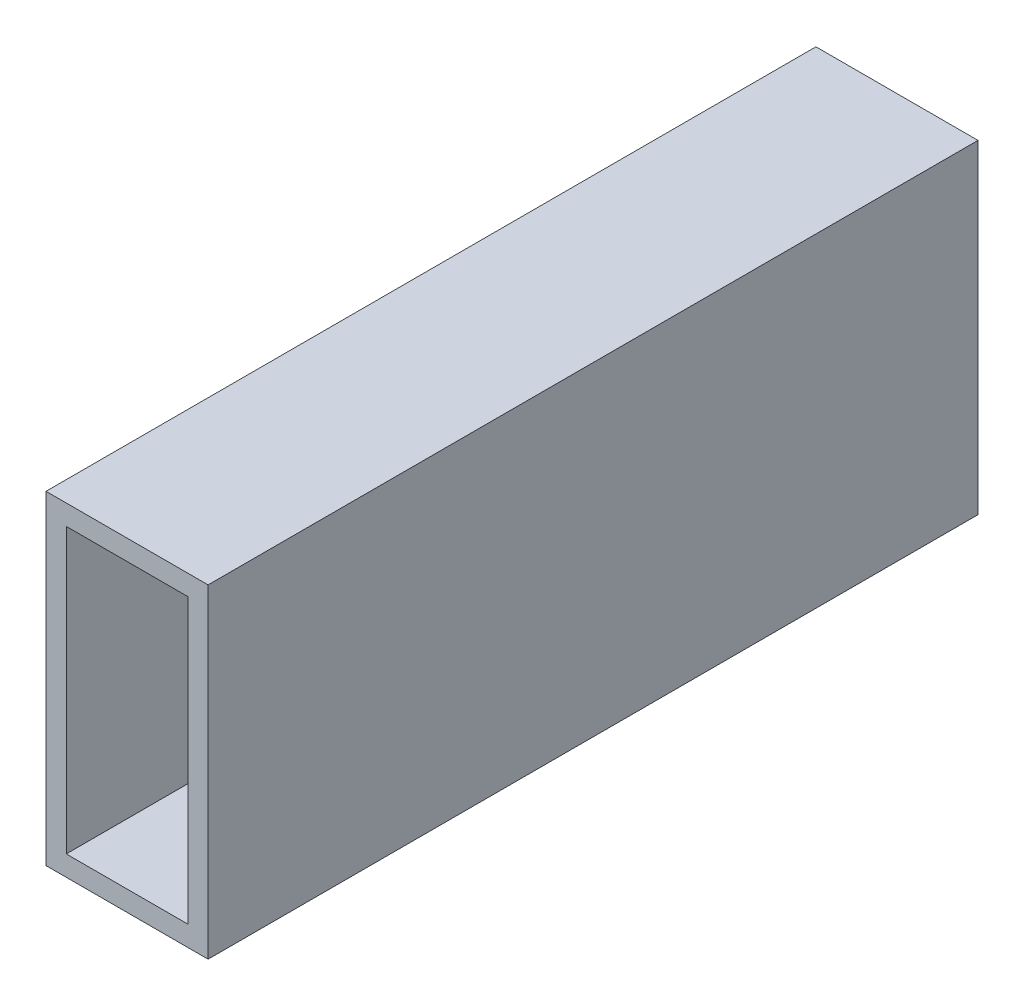
ISO-10303-21;
HEADER;
FILE_DESCRIPTION(('STEP AP214'),'2;1');
FILE_NAME('part.step','',(''),(''),'','','');
FILE_SCHEMA(('AUTOMOTIVE_DESIGN { 1 0 10303 214 1 1 1 1 }'));
ENDSEC;
DATA;
#1=APPLICATION_CONTEXT('core data for automotive mechanical design processes');
#2=APPLICATION_PROTOCOL_DEFINITION('international standard','automotive_design',2000,#1);
#3=PRODUCT_CONTEXT('',#1,'mechanical');
#4=PRODUCT('Part','Part','',(#3));
#5=PRODUCT_RELATED_PRODUCT_CATEGORY('part','',(#4));
#6=PRODUCT_DEFINITION_FORMATION('','',#4);
#7=PRODUCT_DEFINITION_CONTEXT('part definition',#1,'design');
#8=PRODUCT_DEFINITION('design','',#6,#7);
#9=PRODUCT_DEFINITION_SHAPE('','',#8);
#10=(LENGTH_UNIT() NAMED_UNIT(*) SI_UNIT(.MILLI.,.METRE.));
#11=(NAMED_UNIT(*) PLANE_ANGLE_UNIT() SI_UNIT($,.RADIAN.));
#12=(NAMED_UNIT(*) SI_UNIT($,.STERADIAN.) SOLID_ANGLE_UNIT());
#13=UNCERTAINTY_MEASURE_WITH_UNIT(LENGTH_MEASURE(1.E-05),#10,'distance_accuracy_value','');
#14=(GEOMETRIC_REPRESENTATION_CONTEXT(3) GLOBAL_UNCERTAINTY_ASSIGNED_CONTEXT((#13)) GLOBAL_UNIT_ASSIGNED_CONTEXT((#10,
#11,#12)) REPRESENTATION_CONTEXT('',''));
#15=CARTESIAN_POINT('',(0.,0.,0.));
#16=DIRECTION('',(0.,0.,1.));
#17=DIRECTION('',(1.,0.,0.));
#18=AXIS2_PLACEMENT_3D('',#15,#16,#17);
#19=CARTESIAN_POINT('',(0.,0.,120.65));
#20=DIRECTION('',(0.,0.,-1.));
#21=DIRECTION('',(-1.,0.,0.));
#22=AXIS2_PLACEMENT_3D('',#19,#20,#21);
#23=PLANE('',#22);
#24=DIRECTION('',(0.,-1.,0.));
#25=VECTOR('',#24,1.);
#26=CARTESIAN_POINT('',(0.,0.,120.65));
#27=LINE('',#26,#25);
#28=CARTESIAN_POINT('',(0.,50.8,120.65));
#29=VERTEX_POINT('',#28);
#30=CARTESIAN_POINT('',(0.,0.,120.65));
#31=VERTEX_POINT('',#30);
#32=EDGE_CURVE('E134',#29,#31,#27,.T.);
#33=ORIENTED_EDGE('',*,*,#32,.T.);
#34=DIRECTION('',(1.,0.,0.));
#35=VECTOR('',#34,1.);
#36=CARTESIAN_POINT('',(0.,0.,120.65));
#37=LINE('',#36,#35);
#38=CARTESIAN_POINT('',(25.4,0.,120.65));
#39=VERTEX_POINT('',#38);
#40=EDGE_CURVE('E137',#31,#39,#37,.T.);
#41=ORIENTED_EDGE('',*,*,#40,.T.);
#42=DIRECTION('',(0.,1.,0.));
#43=VECTOR('',#42,1.);
#44=CARTESIAN_POINT('',(25.4,0.,120.65));
#45=LINE('',#44,#43);
#46=CARTESIAN_POINT('',(25.4,50.8,120.65));
#47=VERTEX_POINT('',#46);
#48=EDGE_CURVE('E140',#39,#47,#45,.T.);
#49=ORIENTED_EDGE('',*,*,#48,.T.);
#50=DIRECTION('',(-1.,0.,0.));
#51=VECTOR('',#50,1.);
#52=CARTESIAN_POINT('',(0.,50.8,120.65));
#53=LINE('',#52,#51);
#54=EDGE_CURVE('E142',#47,#29,#53,.T.);
#55=ORIENTED_EDGE('',*,*,#54,.T.);
#56=EDGE_LOOP('',(#33,#41,#49,#55));
#57=FACE_BOUND('',#56,.T.);
#58=DIRECTION('',(1.,0.,0.));
#59=VECTOR('',#58,1.);
#60=CARTESIAN_POINT('',(3.175,3.175,120.65));
#61=LINE('',#60,#59);
#62=CARTESIAN_POINT('',(3.175,3.175,120.65));
#63=VERTEX_POINT('',#62);
#64=CARTESIAN_POINT('',(22.225,3.175,120.65));
#65=VERTEX_POINT('',#64);
#66=EDGE_CURVE('E98',#63,#65,#61,.T.);
#67=ORIENTED_EDGE('',*,*,#66,.F.);
#68=DIRECTION('',(0.,-1.,0.));
#69=VECTOR('',#68,1.);
#70=CARTESIAN_POINT('',(3.175,3.175,120.65));
#71=LINE('',#70,#69);
#72=CARTESIAN_POINT('',(3.175,47.625,120.65));
#73=VERTEX_POINT('',#72);
#74=EDGE_CURVE('E120',#73,#63,#71,.T.);
#75=ORIENTED_EDGE('',*,*,#74,.F.);
#76=DIRECTION('',(-1.,0.,0.));
#77=VECTOR('',#76,1.);
#78=CARTESIAN_POINT('',(3.175,47.625,120.65));
#79=LINE('',#78,#77);
#80=CARTESIAN_POINT('',(22.225,47.625,120.65));
#81=VERTEX_POINT('',#80);
#82=EDGE_CURVE('E118',#81,#73,#79,.T.);
#83=ORIENTED_EDGE('',*,*,#82,.F.);
#84=DIRECTION('',(0.,1.,0.));
#85=VECTOR('',#84,1.);
#86=CARTESIAN_POINT('',(22.225,3.175,120.65));
#87=LINE('',#86,#85);
#88=EDGE_CURVE('E106',#65,#81,#87,.T.);
#89=ORIENTED_EDGE('',*,*,#88,.F.);
#90=EDGE_LOOP('',(#67,#75,#83,#89));
#91=FACE_BOUND('',#90,.T.);
#92=ADVANCED_FACE('F33',(#57,#91),#23,.F.);
#93=CARTESIAN_POINT('',(0.,0.,0.));
#94=DIRECTION('',(0.,0.,-1.));
#95=DIRECTION('',(-1.,0.,0.));
#96=AXIS2_PLACEMENT_3D('',#93,#94,#95);
#97=PLANE('',#96);
#98=DIRECTION('',(0.,-1.,0.));
#99=VECTOR('',#98,1.);
#100=CARTESIAN_POINT('',(0.,0.,0.));
#101=LINE('',#100,#99);
#102=CARTESIAN_POINT('',(0.,50.8,0.));
#103=VERTEX_POINT('',#102);
#104=CARTESIAN_POINT('',(0.,0.,0.));
#105=VERTEX_POINT('',#104);
#106=EDGE_CURVE('E114',#103,#105,#101,.T.);
#107=ORIENTED_EDGE('',*,*,#106,.F.);
#108=DIRECTION('',(-1.,0.,0.));
#109=VECTOR('',#108,1.);
#110=CARTESIAN_POINT('',(0.,50.8,0.));
#111=LINE('',#110,#109);
#112=CARTESIAN_POINT('',(25.4,50.8,0.));
#113=VERTEX_POINT('',#112);
#114=EDGE_CURVE('E138',#113,#103,#111,.T.);
#115=ORIENTED_EDGE('',*,*,#114,.F.);
#116=DIRECTION('',(0.,1.,0.));
#117=VECTOR('',#116,1.);
#118=CARTESIAN_POINT('',(25.4,0.,0.));
#119=LINE('',#118,#117);
#120=CARTESIAN_POINT('',(25.4,0.,0.));
#121=VERTEX_POINT('',#120);
#122=EDGE_CURVE('E149',#121,#113,#119,.T.);
#123=ORIENTED_EDGE('',*,*,#122,.F.);
#124=DIRECTION('',(1.,0.,0.));
#125=VECTOR('',#124,1.);
#126=CARTESIAN_POINT('',(0.,0.,0.));
#127=LINE('',#126,#125);
#128=EDGE_CURVE('E147',#105,#121,#127,.T.);
#129=ORIENTED_EDGE('',*,*,#128,.F.);
#130=EDGE_LOOP('',(#107,#115,#123,#129));
#131=FACE_BOUND('',#130,.T.);
#132=DIRECTION('',(0.,-1.,0.));
#133=VECTOR('',#132,1.);
#134=CARTESIAN_POINT('',(3.175,3.175,0.));
#135=LINE('',#134,#133);
#136=CARTESIAN_POINT('',(3.175,47.625,0.));
#137=VERTEX_POINT('',#136);
#138=CARTESIAN_POINT('',(3.175,3.175,0.));
#139=VERTEX_POINT('',#138);
#140=EDGE_CURVE('E107',#137,#139,#135,.T.);
#141=ORIENTED_EDGE('',*,*,#140,.T.);
#142=DIRECTION('',(1.,0.,0.));
#143=VECTOR('',#142,1.);
#144=CARTESIAN_POINT('',(3.175,3.175,0.));
#145=LINE('',#144,#143);
#146=CARTESIAN_POINT('',(22.225,3.175,0.));
#147=VERTEX_POINT('',#146);
#148=EDGE_CURVE('E56',#139,#147,#145,.T.);
#149=ORIENTED_EDGE('',*,*,#148,.T.);
#150=DIRECTION('',(0.,1.,0.));
#151=VECTOR('',#150,1.);
#152=CARTESIAN_POINT('',(22.225,3.175,0.));
#153=LINE('',#152,#151);
#154=CARTESIAN_POINT('',(22.225,47.625,0.));
#155=VERTEX_POINT('',#154);
#156=EDGE_CURVE('E113',#147,#155,#153,.T.);
#157=ORIENTED_EDGE('',*,*,#156,.T.);
#158=DIRECTION('',(-1.,0.,0.));
#159=VECTOR('',#158,1.);
#160=CARTESIAN_POINT('',(3.175,47.625,0.));
#161=LINE('',#160,#159);
#162=EDGE_CURVE('E126',#155,#137,#161,.T.);
#163=ORIENTED_EDGE('',*,*,#162,.T.);
#164=EDGE_LOOP('',(#141,#149,#157,#163));
#165=FACE_BOUND('',#164,.T.);
#166=ADVANCED_FACE('F167',(#131,#165),#97,.T.);
#167=CARTESIAN_POINT('',(0.,0.,120.65));
#168=DIRECTION('',(1.,0.,0.));
#169=DIRECTION('',(0.,0.,-1.));
#170=AXIS2_PLACEMENT_3D('',#167,#168,#169);
#171=PLANE('',#170);
#172=ORIENTED_EDGE('',*,*,#106,.T.);
#173=DIRECTION('',(0.,0.,-1.));
#174=VECTOR('',#173,1.);
#175=CARTESIAN_POINT('',(0.,0.,120.65));
#176=LINE('',#175,#174);
#177=EDGE_CURVE('E11',#31,#105,#176,.T.);
#178=ORIENTED_EDGE('',*,*,#177,.F.);
#179=ORIENTED_EDGE('',*,*,#32,.F.);
#180=DIRECTION('',(0.,0.,-1.));
#181=VECTOR('',#180,1.);
#182=CARTESIAN_POINT('',(0.,50.8,120.65));
#183=LINE('',#182,#181);
#184=EDGE_CURVE('E144',#29,#103,#183,.T.);
#185=ORIENTED_EDGE('',*,*,#184,.T.);
#186=EDGE_LOOP('',(#172,#178,#179,#185));
#187=FACE_BOUND('',#186,.T.);
#188=ADVANCED_FACE('F35',(#187),#171,.F.);
#189=CARTESIAN_POINT('',(0.,0.,120.65));
#190=DIRECTION('',(0.,1.,0.));
#191=DIRECTION('',(0.,0.,1.));
#192=AXIS2_PLACEMENT_3D('',#189,#190,#191);
#193=PLANE('',#192);
#194=ORIENTED_EDGE('',*,*,#128,.T.);
#195=DIRECTION('',(0.,0.,-1.));
#196=VECTOR('',#195,1.);
#197=CARTESIAN_POINT('',(25.4,0.,120.65));
#198=LINE('',#197,#196);
#199=EDGE_CURVE('E41',#39,#121,#198,.T.);
#200=ORIENTED_EDGE('',*,*,#199,.F.);
#201=ORIENTED_EDGE('',*,*,#40,.F.);
#202=ORIENTED_EDGE('',*,*,#177,.T.);
#203=EDGE_LOOP('',(#194,#200,#201,#202));
#204=FACE_BOUND('',#203,.T.);
#205=ADVANCED_FACE('F177',(#204),#193,.F.);
#206=CARTESIAN_POINT('',(25.4,0.,120.65));
#207=DIRECTION('',(-1.,0.,0.));
#208=DIRECTION('',(0.,0.,1.));
#209=AXIS2_PLACEMENT_3D('',#206,#207,#208);
#210=PLANE('',#209);
#211=ORIENTED_EDGE('',*,*,#122,.T.);
#212=DIRECTION('',(0.,0.,-1.));
#213=VECTOR('',#212,1.);
#214=CARTESIAN_POINT('',(25.4,50.8,120.65));
#215=LINE('',#214,#213);
#216=EDGE_CURVE('E154',#47,#113,#215,.T.);
#217=ORIENTED_EDGE('',*,*,#216,.F.);
#218=ORIENTED_EDGE('',*,*,#48,.F.);
#219=ORIENTED_EDGE('',*,*,#199,.T.);
#220=EDGE_LOOP('',(#211,#217,#218,#219));
#221=FACE_BOUND('',#220,.T.);
#222=ADVANCED_FACE('F161',(#221),#210,.F.);
#223=CARTESIAN_POINT('',(0.,50.8,120.65));
#224=DIRECTION('',(0.,-1.,0.));
#225=DIRECTION('',(0.,0.,-1.));
#226=AXIS2_PLACEMENT_3D('',#223,#224,#225);
#227=PLANE('',#226);
#228=ORIENTED_EDGE('',*,*,#114,.T.);
#229=ORIENTED_EDGE('',*,*,#184,.F.);
#230=ORIENTED_EDGE('',*,*,#54,.F.);
#231=ORIENTED_EDGE('',*,*,#216,.T.);
#232=EDGE_LOOP('',(#228,#229,#230,#231));
#233=FACE_BOUND('',#232,.T.);
#234=ADVANCED_FACE('F171',(#233),#227,.F.);
#235=CARTESIAN_POINT('',(3.175,3.175,120.65));
#236=DIRECTION('',(0.,1.,0.));
#237=DIRECTION('',(0.,0.,1.));
#238=AXIS2_PLACEMENT_3D('',#235,#236,#237);
#239=PLANE('',#238);
#240=ORIENTED_EDGE('',*,*,#148,.F.);
#241=DIRECTION('',(0.,0.,-1.));
#242=VECTOR('',#241,1.);
#243=CARTESIAN_POINT('',(3.175,3.175,120.65));
#244=LINE('',#243,#242);
#245=EDGE_CURVE('E102',#63,#139,#244,.T.);
#246=ORIENTED_EDGE('',*,*,#245,.F.);
#247=ORIENTED_EDGE('',*,*,#66,.T.);
#248=DIRECTION('',(0.,0.,-1.));
#249=VECTOR('',#248,1.);
#250=CARTESIAN_POINT('',(22.225,3.175,120.65));
#251=LINE('',#250,#249);
#252=EDGE_CURVE('E101',#65,#147,#251,.T.);
#253=ORIENTED_EDGE('',*,*,#252,.T.);
#254=EDGE_LOOP('',(#240,#246,#247,#253));
#255=FACE_BOUND('',#254,.T.);
#256=ADVANCED_FACE('F100',(#255),#239,.T.);
#257=CARTESIAN_POINT('',(22.225,3.175,120.65));
#258=DIRECTION('',(-1.,0.,0.));
#259=DIRECTION('',(0.,0.,1.));
#260=AXIS2_PLACEMENT_3D('',#257,#258,#259);
#261=PLANE('',#260);
#262=ORIENTED_EDGE('',*,*,#156,.F.);
#263=ORIENTED_EDGE('',*,*,#252,.F.);
#264=ORIENTED_EDGE('',*,*,#88,.T.);
#265=DIRECTION('',(0.,0.,-1.));
#266=VECTOR('',#265,1.);
#267=CARTESIAN_POINT('',(22.225,47.625,120.65));
#268=LINE('',#267,#266);
#269=EDGE_CURVE('E115',#81,#155,#268,.T.);
#270=ORIENTED_EDGE('',*,*,#269,.T.);
#271=EDGE_LOOP('',(#262,#263,#264,#270));
#272=FACE_BOUND('',#271,.T.);
#273=ADVANCED_FACE('F110',(#272),#261,.T.);
#274=CARTESIAN_POINT('',(3.175,47.625,120.65));
#275=DIRECTION('',(0.,-1.,0.));
#276=DIRECTION('',(0.,0.,-1.));
#277=AXIS2_PLACEMENT_3D('',#274,#275,#276);
#278=PLANE('',#277);
#279=ORIENTED_EDGE('',*,*,#162,.F.);
#280=ORIENTED_EDGE('',*,*,#269,.F.);
#281=ORIENTED_EDGE('',*,*,#82,.T.);
#282=DIRECTION('',(0.,0.,-1.));
#283=VECTOR('',#282,1.);
#284=CARTESIAN_POINT('',(3.175,47.625,120.65));
#285=LINE('',#284,#283);
#286=EDGE_CURVE('E48',#73,#137,#285,.T.);
#287=ORIENTED_EDGE('',*,*,#286,.T.);
#288=EDGE_LOOP('',(#279,#280,#281,#287));
#289=FACE_BOUND('',#288,.T.);
#290=ADVANCED_FACE('F200',(#289),#278,.T.);
#291=CARTESIAN_POINT('',(3.175,3.175,120.65));
#292=DIRECTION('',(1.,0.,0.));
#293=DIRECTION('',(0.,0.,-1.));
#294=AXIS2_PLACEMENT_3D('',#291,#292,#293);
#295=PLANE('',#294);
#296=ORIENTED_EDGE('',*,*,#140,.F.);
#297=ORIENTED_EDGE('',*,*,#286,.F.);
#298=ORIENTED_EDGE('',*,*,#74,.T.);
#299=ORIENTED_EDGE('',*,*,#245,.T.);
#300=EDGE_LOOP('',(#296,#297,#298,#299));
#301=FACE_BOUND('',#300,.T.);
#302=ADVANCED_FACE('F204',(#301),#295,.T.);
#303=CLOSED_SHELL('',(#92,#166,#188,#205,#222,#234,#256,#273,#290,#302));
#304=MANIFOLD_SOLID_BREP('B2',#303);
#305=ADVANCED_BREP_SHAPE_REPRESENTATION('',(#18,#304),#14);
#306=SHAPE_DEFINITION_REPRESENTATION(#9,#305);
ENDSEC;
END-ISO-10303-21;
